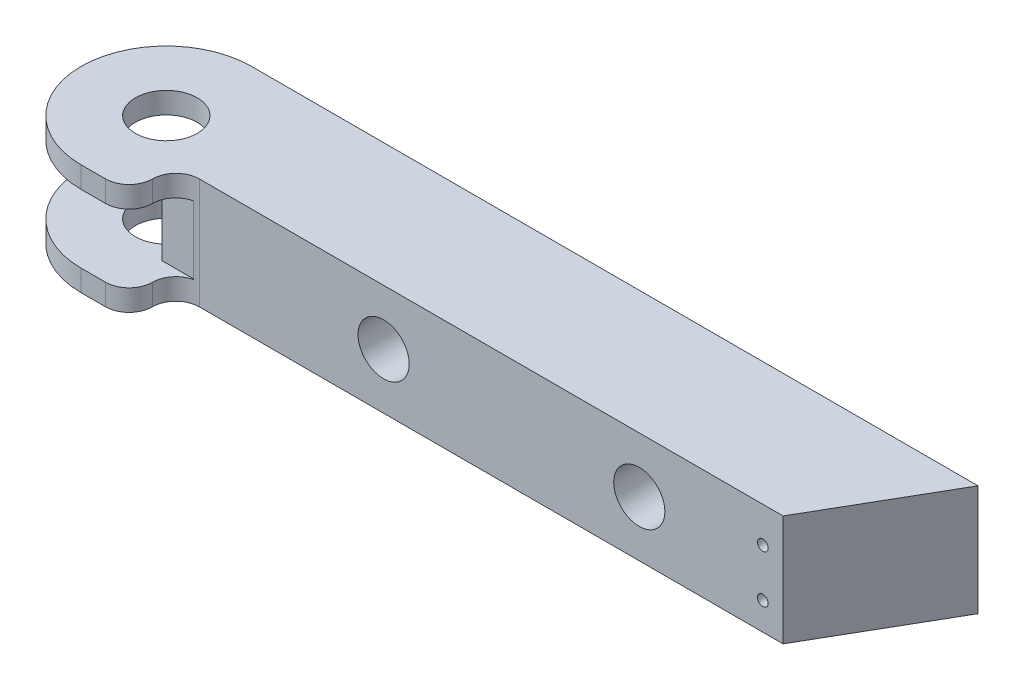
ISO-10303-21;
HEADER;
FILE_DESCRIPTION(('STEP AP214'),'2;1');
FILE_NAME('part.step','',(''),(''),'','','');
FILE_SCHEMA(('AUTOMOTIVE_DESIGN { 1 0 10303 214 1 1 1 1 }'));
ENDSEC;
DATA;
#1=APPLICATION_CONTEXT('core data for automotive mechanical design processes');
#2=APPLICATION_PROTOCOL_DEFINITION('international standard','automotive_design',2000,#1);
#3=PRODUCT_CONTEXT('',#1,'mechanical');
#4=PRODUCT('Part','Part','',(#3));
#5=PRODUCT_RELATED_PRODUCT_CATEGORY('part','',(#4));
#6=PRODUCT_DEFINITION_FORMATION('','',#4);
#7=PRODUCT_DEFINITION_CONTEXT('part definition',#1,'design');
#8=PRODUCT_DEFINITION('design','',#6,#7);
#9=PRODUCT_DEFINITION_SHAPE('','',#8);
#10=(LENGTH_UNIT() NAMED_UNIT(*) SI_UNIT(.MILLI.,.METRE.));
#11=(NAMED_UNIT(*) PLANE_ANGLE_UNIT() SI_UNIT($,.RADIAN.));
#12=(NAMED_UNIT(*) SI_UNIT($,.STERADIAN.) SOLID_ANGLE_UNIT());
#13=UNCERTAINTY_MEASURE_WITH_UNIT(LENGTH_MEASURE(1.E-05),#10,'distance_accuracy_value','');
#14=(GEOMETRIC_REPRESENTATION_CONTEXT(3) GLOBAL_UNCERTAINTY_ASSIGNED_CONTEXT((#13)) GLOBAL_UNIT_ASSIGNED_CONTEXT((#10,
#11,#12)) REPRESENTATION_CONTEXT('',''));
#15=CARTESIAN_POINT('',(0.,0.,0.));
#16=DIRECTION('',(0.,0.,1.));
#17=DIRECTION('',(1.,0.,0.));
#18=AXIS2_PLACEMENT_3D('',#15,#16,#17);
#19=CARTESIAN_POINT('',(-5.61288074759463,0.,-0.0974134343959925));
#20=DIRECTION('',(0.,1.,0.));
#21=DIRECTION('',(0.,0.,1.));
#22=AXIS2_PLACEMENT_3D('',#19,#20,#21);
#23=CYLINDRICAL_SURFACE('',#22,1.45);
#24=CARTESIAN_POINT('',(-5.61288074759463,5.2,-0.0974134343959925));
#25=DIRECTION('',(0.,1.,0.));
#26=DIRECTION('',(0.,0.,1.));
#27=AXIS2_PLACEMENT_3D('',#24,#25,#26);
#28=CIRCLE('',#27,1.45);
#29=CARTESIAN_POINT('',(-5.61288074759463,5.2,1.35258656560401));
#30=VERTEX_POINT('',#29);
#31=EDGE_CURVE('E199',#30,#30,#28,.T.);
#32=ORIENTED_EDGE('',*,*,#31,.T.);
#33=EDGE_LOOP('',(#32));
#34=FACE_BOUND('',#33,.T.);
#35=CARTESIAN_POINT('',(-5.61288074759463,4.2,-0.0974134343959925));
#36=DIRECTION('',(0.,-1.,0.));
#37=DIRECTION('',(0.,0.,-1.));
#38=AXIS2_PLACEMENT_3D('',#35,#36,#37);
#39=CIRCLE('',#38,1.45);
#40=CARTESIAN_POINT('',(-5.61288074759463,4.2,-1.54741343439599));
#41=VERTEX_POINT('',#40);
#42=EDGE_CURVE('E263',#41,#41,#39,.F.);
#43=ORIENTED_EDGE('',*,*,#42,.F.);
#44=EDGE_LOOP('',(#43));
#45=FACE_BOUND('',#44,.T.);
#46=ADVANCED_FACE('F35',(#34,#45),#23,.F.);
#47=CARTESIAN_POINT('',(-5.61288074759464,1.,-4.09741343439599));
#48=DIRECTION('',(1.,0.,0.));
#49=DIRECTION('',(0.,0.,-1.));
#50=AXIS2_PLACEMENT_3D('',#47,#48,#49);
#51=PLANE('',#50);
#52=DIRECTION('',(0.,1.,0.));
#53=VECTOR('',#52,1.);
#54=CARTESIAN_POINT('',(-5.61288074759464,-5.78822509939086,-2.49741343439599));
#55=LINE('',#54,#53);
#56=CARTESIAN_POINT('',(-5.61288074759464,4.2,-2.49741343439599));
#57=VERTEX_POINT('',#56);
#58=CARTESIAN_POINT('',(-5.61288074759464,1.,-2.49741343439599));
#59=VERTEX_POINT('',#58);
#60=EDGE_CURVE('E156',#57,#59,#55,.F.);
#61=ORIENTED_EDGE('',*,*,#60,.F.);
#62=DIRECTION('',(0.,0.,-1.));
#63=VECTOR('',#62,1.);
#64=CARTESIAN_POINT('',(-5.61288074759464,4.2,-4.09741343439599));
#65=LINE('',#64,#63);
#66=CARTESIAN_POINT('',(-5.61288074759464,4.2,-4.09741343439599));
#67=VERTEX_POINT('',#66);
#68=EDGE_CURVE('E188',#57,#67,#65,.T.);
#69=ORIENTED_EDGE('',*,*,#68,.T.);
#70=DIRECTION('',(0.,1.,0.));
#71=VECTOR('',#70,1.);
#72=CARTESIAN_POINT('',(-5.61288074759464,1.,-4.09741343439599));
#73=LINE('',#72,#71);
#74=CARTESIAN_POINT('',(-5.61288074759464,1.,-4.09741343439599));
#75=VERTEX_POINT('',#74);
#76=EDGE_CURVE('E177',#75,#67,#73,.T.);
#77=ORIENTED_EDGE('',*,*,#76,.F.);
#78=DIRECTION('',(0.,0.,-1.));
#79=VECTOR('',#78,1.);
#80=CARTESIAN_POINT('',(-5.61288074759464,1.,-4.09741343439599));
#81=LINE('',#80,#79);
#82=EDGE_CURVE('E170',#59,#75,#81,.T.);
#83=ORIENTED_EDGE('',*,*,#82,.F.);
#84=EDGE_LOOP('',(#61,#69,#77,#83));
#85=FACE_BOUND('',#84,.T.);
#86=ADVANCED_FACE('F175',(#85),#51,.F.);
#87=CARTESIAN_POINT('',(-5.61288074759463,-2.80131556174964,1.70258656560401));
#88=DIRECTION('',(0.,0.,1.));
#89=DIRECTION('',(1.,0.,0.));
#90=AXIS2_PLACEMENT_3D('',#87,#88,#89);
#91=PLANE('',#90);
#92=DIRECTION('',(1.,0.,0.));
#93=VECTOR('',#92,1.);
#94=CARTESIAN_POINT('',(-5.61288074759463,4.2,1.70258656560401));
#95=LINE('',#94,#93);
#96=CARTESIAN_POINT('',(-4.02542996095588,4.2,1.70258656560401));
#97=VERTEX_POINT('',#96);
#98=CARTESIAN_POINT('',(-2.51288074759464,4.2,1.70258656560401));
#99=VERTEX_POINT('',#98);
#100=EDGE_CURVE('E165',#97,#99,#95,.T.);
#101=ORIENTED_EDGE('',*,*,#100,.F.);
#102=DIRECTION('',(0.,1.,0.));
#103=VECTOR('',#102,1.);
#104=CARTESIAN_POINT('',(-4.02542996095588,-5.78822509939086,1.70258656560401));
#105=LINE('',#104,#103);
#106=CARTESIAN_POINT('',(-4.02542996095588,1.,1.70258656560401));
#107=VERTEX_POINT('',#106);
#108=EDGE_CURVE('E11',#97,#107,#105,.F.);
#109=ORIENTED_EDGE('',*,*,#108,.T.);
#110=DIRECTION('',(1.,0.,0.));
#111=VECTOR('',#110,1.);
#112=CARTESIAN_POINT('',(-5.61288074759463,1.,1.70258656560401));
#113=LINE('',#112,#111);
#114=CARTESIAN_POINT('',(-2.51288074759464,1.,1.70258656560401));
#115=VERTEX_POINT('',#114);
#116=EDGE_CURVE('E173',#107,#115,#113,.T.);
#117=ORIENTED_EDGE('',*,*,#116,.T.);
#118=DIRECTION('',(0.,1.,0.));
#119=VECTOR('',#118,1.);
#120=CARTESIAN_POINT('',(-2.51288074759464,-2.80131556174964,1.70258656560401));
#121=LINE('',#120,#119);
#122=EDGE_CURVE('E297',#115,#99,#121,.T.);
#123=ORIENTED_EDGE('',*,*,#122,.T.);
#124=EDGE_LOOP('',(#101,#109,#117,#123));
#125=FACE_BOUND('',#124,.T.);
#126=ADVANCED_FACE('F338',(#125),#91,.T.);
#127=CARTESIAN_POINT('',(-9.61288074759463,5.2,3.90258656560401));
#128=DIRECTION('',(0.,0.,-1.));
#129=DIRECTION('',(-1.,0.,0.));
#130=AXIS2_PLACEMENT_3D('',#127,#128,#129);
#131=PLANE('',#130);
#132=DIRECTION('',(-1.,0.,0.));
#133=VECTOR('',#132,1.);
#134=CARTESIAN_POINT('',(-5.61288074759463,4.2,3.90258656560401));
#135=LINE('',#134,#133);
#136=CARTESIAN_POINT('',(-4.46288074759464,4.2,3.90258656560401));
#137=VERTEX_POINT('',#136);
#138=CARTESIAN_POINT('',(-5.61288074759463,4.2,3.90258656560401));
#139=VERTEX_POINT('',#138);
#140=EDGE_CURVE('E291',#137,#139,#135,.T.);
#141=ORIENTED_EDGE('',*,*,#140,.F.);
#142=DIRECTION('',(0.,1.,0.));
#143=VECTOR('',#142,1.);
#144=CARTESIAN_POINT('',(-4.46288074759464,5.2,3.90258656560401));
#145=LINE('',#144,#143);
#146=CARTESIAN_POINT('',(-4.46288074759464,5.2,3.90258656560401));
#147=VERTEX_POINT('',#146);
#148=EDGE_CURVE('E254',#137,#147,#145,.T.);
#149=ORIENTED_EDGE('',*,*,#148,.T.);
#150=DIRECTION('',(1.,0.,0.));
#151=VECTOR('',#150,1.);
#152=CARTESIAN_POINT('',(-9.61288074759463,5.2,3.90258656560401));
#153=LINE('',#152,#151);
#154=CARTESIAN_POINT('',(-5.61288074759463,5.2,3.90258656560401));
#155=VERTEX_POINT('',#154);
#156=EDGE_CURVE('E207',#155,#147,#153,.T.);
#157=ORIENTED_EDGE('',*,*,#156,.F.);
#158=DIRECTION('',(0.,-1.,0.));
#159=VECTOR('',#158,1.);
#160=CARTESIAN_POINT('',(-5.61288074759463,5.2,3.90258656560401));
#161=LINE('',#160,#159);
#162=EDGE_CURVE('E237',#155,#139,#161,.T.);
#163=ORIENTED_EDGE('',*,*,#162,.T.);
#164=EDGE_LOOP('',(#141,#149,#157,#163));
#165=FACE_BOUND('',#164,.T.);
#166=ADVANCED_FACE('F323',(#165),#131,.F.);
#167=CARTESIAN_POINT('',(-2.26288074759464,0.,2.80258656560401));
#168=DIRECTION('',(0.,-1.,0.));
#169=DIRECTION('',(0.,0.,-1.));
#170=AXIS2_PLACEMENT_3D('',#167,#168,#169);
#171=CYLINDRICAL_SURFACE('',#170,1.1);
#172=CARTESIAN_POINT('',(-2.26288074759464,4.2,2.80258656560401));
#173=DIRECTION('',(0.,-1.,0.));
#174=DIRECTION('',(0.,0.,-1.));
#175=AXIS2_PLACEMENT_3D('',#172,#173,#174);
#176=CIRCLE('',#175,1.1);
#177=CARTESIAN_POINT('',(-2.51288074759464,4.2,1.73137230132258));
#178=VERTEX_POINT('',#177);
#179=CARTESIAN_POINT('',(-3.36288074759464,4.2,2.80258656560401));
#180=VERTEX_POINT('',#179);
#181=EDGE_CURVE('E313',#178,#180,#176,.F.);
#182=ORIENTED_EDGE('',*,*,#181,.F.);
#183=DIRECTION('',(0.,-1.,0.));
#184=VECTOR('',#183,1.);
#185=CARTESIAN_POINT('',(-2.51288074759464,0.,1.73137230132258));
#186=LINE('',#185,#184);
#187=CARTESIAN_POINT('',(-2.51288074759464,1.,1.73137230132258));
#188=VERTEX_POINT('',#187);
#189=EDGE_CURVE('E44',#188,#178,#186,.F.);
#190=ORIENTED_EDGE('',*,*,#189,.F.);
#191=CARTESIAN_POINT('',(-2.26288074759464,1.,2.80258656560401));
#192=DIRECTION('',(0.,-1.,0.));
#193=DIRECTION('',(0.,0.,-1.));
#194=AXIS2_PLACEMENT_3D('',#191,#192,#193);
#195=CIRCLE('',#194,1.1);
#196=CARTESIAN_POINT('',(-3.36288074759464,0.999999999999999,2.80258656560401));
#197=VERTEX_POINT('',#196);
#198=EDGE_CURVE('E308',#188,#197,#195,.F.);
#199=ORIENTED_EDGE('',*,*,#198,.T.);
#200=DIRECTION('',(0.,1.,0.));
#201=VECTOR('',#200,1.);
#202=CARTESIAN_POINT('',(-3.36288074759464,5.2,2.80258656560401));
#203=LINE('',#202,#201);
#204=CARTESIAN_POINT('',(-3.36288074759464,0.,2.80258656560401));
#205=VERTEX_POINT('',#204);
#206=EDGE_CURVE('E243',#205,#197,#203,.T.);
#207=ORIENTED_EDGE('',*,*,#206,.F.);
#208=CARTESIAN_POINT('',(-2.26288074759464,0.,2.80258656560401));
#209=DIRECTION('',(0.,1.,0.));
#210=DIRECTION('',(0.,0.,1.));
#211=AXIS2_PLACEMENT_3D('',#208,#209,#210);
#212=CIRCLE('',#211,1.1);
#213=CARTESIAN_POINT('',(-2.26288074759464,0.,1.70258656560401));
#214=VERTEX_POINT('',#213);
#215=EDGE_CURVE('E252',#214,#205,#212,.T.);
#216=ORIENTED_EDGE('',*,*,#215,.F.);
#217=DIRECTION('',(0.,1.,0.));
#218=VECTOR('',#217,1.);
#219=CARTESIAN_POINT('',(-2.26288074759464,0.,1.70258656560401));
#220=LINE('',#219,#218);
#221=CARTESIAN_POINT('',(-2.26288074759464,5.2,1.70258656560401));
#222=VERTEX_POINT('',#221);
#223=EDGE_CURVE('E246',#222,#214,#220,.F.);
#224=ORIENTED_EDGE('',*,*,#223,.F.);
#225=CARTESIAN_POINT('',(-2.26288074759464,5.2,2.80258656560401));
#226=DIRECTION('',(0.,1.,0.));
#227=DIRECTION('',(0.,0.,1.));
#228=AXIS2_PLACEMENT_3D('',#225,#226,#227);
#229=CIRCLE('',#228,1.1);
#230=CARTESIAN_POINT('',(-3.36288074759464,5.2,2.80258656560401));
#231=VERTEX_POINT('',#230);
#232=EDGE_CURVE('E249',#231,#222,#229,.F.);
#233=ORIENTED_EDGE('',*,*,#232,.F.);
#234=EDGE_CURVE('E240',#180,#231,#203,.T.);
#235=ORIENTED_EDGE('',*,*,#234,.F.);
#236=EDGE_LOOP('',(#182,#190,#199,#207,#216,#224,#233,#235));
#237=FACE_BOUND('',#236,.T.);
#238=ADVANCED_FACE('F346',(#237),#171,.F.);
#239=CARTESIAN_POINT('',(-4.46288074759464,5.2,2.80258656560401));
#240=DIRECTION('',(0.,1.,0.));
#241=DIRECTION('',(0.,0.,1.));
#242=AXIS2_PLACEMENT_3D('',#239,#240,#241);
#243=CYLINDRICAL_SURFACE('',#242,1.1);
#244=ORIENTED_EDGE('',*,*,#148,.F.);
#245=CARTESIAN_POINT('',(-4.46288074759464,4.2,2.80258656560401));
#246=DIRECTION('',(0.,-1.,0.));
#247=DIRECTION('',(0.,0.,-1.));
#248=AXIS2_PLACEMENT_3D('',#245,#246,#247);
#249=CIRCLE('',#248,1.1);
#250=EDGE_CURVE('E311',#137,#180,#249,.F.);
#251=ORIENTED_EDGE('',*,*,#250,.T.);
#252=ORIENTED_EDGE('',*,*,#234,.T.);
#253=CARTESIAN_POINT('',(-4.46288074759464,5.2,2.80258656560401));
#254=DIRECTION('',(0.,1.,0.));
#255=DIRECTION('',(0.,0.,1.));
#256=AXIS2_PLACEMENT_3D('',#253,#254,#255);
#257=CIRCLE('',#256,1.1);
#258=EDGE_CURVE('E258',#147,#231,#257,.T.);
#259=ORIENTED_EDGE('',*,*,#258,.F.);
#260=EDGE_LOOP('',(#244,#251,#252,#259));
#261=FACE_BOUND('',#260,.T.);
#262=ADVANCED_FACE('F349',(#261),#243,.T.);
#263=CARTESIAN_POINT('',(-5.61288074759463,5.2,-0.0974134343959933));
#264=DIRECTION('',(0.,-1.,0.));
#265=DIRECTION('',(0.,0.,-1.));
#266=AXIS2_PLACEMENT_3D('',#263,#264,#265);
#267=CYLINDRICAL_SURFACE('',#266,4.);
#268=DIRECTION('',(0.,-1.,0.));
#269=VECTOR('',#268,1.);
#270=CARTESIAN_POINT('',(-9.61288074759463,5.2,-0.0974134343959925));
#271=LINE('',#270,#269);
#272=CARTESIAN_POINT('',(-9.61288074759463,4.2,-0.0974134343959925));
#273=VERTEX_POINT('',#272);
#274=CARTESIAN_POINT('',(-9.61288074759463,5.2,-0.0974134343959925));
#275=VERTEX_POINT('',#274);
#276=EDGE_CURVE('E204',#273,#275,#271,.F.);
#277=ORIENTED_EDGE('',*,*,#276,.F.);
#278=CARTESIAN_POINT('',(-5.61288074759463,4.2,-0.0974134343959925));
#279=DIRECTION('',(0.,1.,0.));
#280=DIRECTION('',(0.,0.,-1.));
#281=AXIS2_PLACEMENT_3D('',#278,#279,#280);
#282=CIRCLE('',#281,4.);
#283=EDGE_CURVE('E52',#273,#139,#282,.T.);
#284=ORIENTED_EDGE('',*,*,#283,.T.);
#285=ORIENTED_EDGE('',*,*,#162,.F.);
#286=CARTESIAN_POINT('',(-5.61288074759463,5.2,-0.0974134343959933));
#287=DIRECTION('',(0.,1.,0.));
#288=DIRECTION('',(0.,0.,1.));
#289=AXIS2_PLACEMENT_3D('',#286,#287,#288);
#290=CIRCLE('',#289,4.);
#291=EDGE_CURVE('E231',#275,#155,#290,.T.);
#292=ORIENTED_EDGE('',*,*,#291,.F.);
#293=EDGE_LOOP('',(#277,#284,#285,#292));
#294=FACE_BOUND('',#293,.T.);
#295=ADVANCED_FACE('F318',(#294),#267,.T.);
#296=CARTESIAN_POINT('',(-5.61288074759463,5.2,-0.0974134343959933));
#297=DIRECTION('',(0.,-1.,0.));
#298=DIRECTION('',(0.,0.,-1.));
#299=AXIS2_PLACEMENT_3D('',#296,#297,#298);
#300=CYLINDRICAL_SURFACE('',#299,4.);
#301=DIRECTION('',(0.,-1.,0.));
#302=VECTOR('',#301,1.);
#303=CARTESIAN_POINT('',(-5.61288074759463,5.2,-4.09741343439599));
#304=LINE('',#303,#302);
#305=CARTESIAN_POINT('',(-5.61288074759464,5.2,-4.09741343439599));
#306=VERTEX_POINT('',#305);
#307=EDGE_CURVE('E227',#67,#306,#304,.F.);
#308=ORIENTED_EDGE('',*,*,#307,.F.);
#309=EDGE_CURVE('E186',#67,#273,#282,.T.);
#310=ORIENTED_EDGE('',*,*,#309,.T.);
#311=ORIENTED_EDGE('',*,*,#276,.T.);
#312=CARTESIAN_POINT('',(-5.61288074759463,5.2,-0.0974134343959933));
#313=DIRECTION('',(0.,1.,0.));
#314=DIRECTION('',(0.,0.,1.));
#315=AXIS2_PLACEMENT_3D('',#312,#313,#314);
#316=CIRCLE('',#315,4.);
#317=EDGE_CURVE('E233',#306,#275,#316,.T.);
#318=ORIENTED_EDGE('',*,*,#317,.F.);
#319=EDGE_LOOP('',(#308,#310,#311,#318));
#320=FACE_BOUND('',#319,.T.);
#321=ADVANCED_FACE('F334',(#320),#300,.T.);
#322=CARTESIAN_POINT('',(-4.46288074759464,0.,3.90258656560401));
#323=VERTEX_POINT('',#322);
#324=CARTESIAN_POINT('',(-4.46288074759464,0.999999999999999,3.90258656560401));
#325=VERTEX_POINT('',#324);
#326=EDGE_CURVE('E255',#323,#325,#145,.T.);
#327=ORIENTED_EDGE('',*,*,#326,.T.);
#328=DIRECTION('',(-1.,0.,0.));
#329=VECTOR('',#328,1.);
#330=CARTESIAN_POINT('',(-5.61288074759463,1.,3.90258656560401));
#331=LINE('',#330,#329);
#332=CARTESIAN_POINT('',(-5.61288074759463,1.,3.90258656560401));
#333=VERTEX_POINT('',#332);
#334=EDGE_CURVE('E293',#325,#333,#331,.T.);
#335=ORIENTED_EDGE('',*,*,#334,.T.);
#336=CARTESIAN_POINT('',(-5.61288074759463,0.,3.90258656560401));
#337=VERTEX_POINT('',#336);
#338=EDGE_CURVE('E236',#333,#337,#161,.T.);
#339=ORIENTED_EDGE('',*,*,#338,.T.);
#340=DIRECTION('',(1.,0.,0.));
#341=VECTOR('',#340,1.);
#342=CARTESIAN_POINT('',(-9.61288074759463,0.,3.90258656560401));
#343=LINE('',#342,#341);
#344=EDGE_CURVE('E215',#337,#323,#343,.T.);
#345=ORIENTED_EDGE('',*,*,#344,.T.);
#346=EDGE_LOOP('',(#327,#335,#339,#345));
#347=FACE_BOUND('',#346,.T.);
#348=ADVANCED_FACE('F404',(#347),#131,.F.);
#349=CARTESIAN_POINT('',(-9.61288074759463,5.2,-4.09741343439599));
#350=DIRECTION('',(0.,0.,1.));
#351=DIRECTION('',(1.,0.,0.));
#352=AXIS2_PLACEMENT_3D('',#349,#350,#351);
#353=PLANE('',#352);
#354=CARTESIAN_POINT('',(24.1871192524054,3.53944035944664,-4.09741343439599));
#355=DIRECTION('',(0.,0.,-1.));
#356=DIRECTION('',(-1.,0.,0.));
#357=AXIS2_PLACEMENT_3D('',#354,#355,#356);
#358=CIRCLE('',#357,0.25);
#359=CARTESIAN_POINT('',(23.9371192524054,3.53944035944664,-4.09741343439599));
#360=VERTEX_POINT('',#359);
#361=EDGE_CURVE('E448',#360,#360,#358,.T.);
#362=ORIENTED_EDGE('',*,*,#361,.F.);
#363=EDGE_LOOP('',(#362));
#364=FACE_BOUND('',#363,.T.);
#365=CARTESIAN_POINT('',(24.1871192524054,1.29267803209743,-4.09741343439599));
#366=DIRECTION('',(0.,0.,-1.));
#367=DIRECTION('',(-1.,0.,0.));
#368=AXIS2_PLACEMENT_3D('',#365,#366,#367);
#369=CIRCLE('',#368,0.25);
#370=CARTESIAN_POINT('',(23.9371192524054,1.29267803209743,-4.09741343439599));
#371=VERTEX_POINT('',#370);
#372=EDGE_CURVE('E284',#371,#371,#369,.T.);
#373=ORIENTED_EDGE('',*,*,#372,.F.);
#374=EDGE_LOOP('',(#373));
#375=FACE_BOUND('',#374,.T.);
#376=CARTESIAN_POINT('',(6.38711925240536,2.6,-4.09741343439599));
#377=DIRECTION('',(0.,0.,-1.));
#378=DIRECTION('',(-1.,0.,0.));
#379=AXIS2_PLACEMENT_3D('',#376,#377,#378);
#380=CIRCLE('',#379,1.2);
#381=CARTESIAN_POINT('',(5.18711925240536,2.6,-4.09741343439599));
#382=VERTEX_POINT('',#381);
#383=EDGE_CURVE('E272',#382,#382,#380,.T.);
#384=ORIENTED_EDGE('',*,*,#383,.F.);
#385=EDGE_LOOP('',(#384));
#386=FACE_BOUND('',#385,.T.);
#387=CARTESIAN_POINT('',(18.3871192524054,2.6,-4.09741343439599));
#388=DIRECTION('',(0.,0.,-1.));
#389=DIRECTION('',(-1.,0.,0.));
#390=AXIS2_PLACEMENT_3D('',#387,#388,#389);
#391=CIRCLE('',#390,1.2);
#392=CARTESIAN_POINT('',(17.1871192524054,2.6,-4.09741343439599));
#393=VERTEX_POINT('',#392);
#394=EDGE_CURVE('E271',#393,#393,#391,.T.);
#395=ORIENTED_EDGE('',*,*,#394,.F.);
#396=EDGE_LOOP('',(#395));
#397=FACE_BOUND('',#396,.T.);
#398=DIRECTION('',(-1.,0.,0.));
#399=VECTOR('',#398,1.);
#400=CARTESIAN_POINT('',(-9.61288074759463,0.,-4.09741343439599));
#401=LINE('',#400,#399);
#402=CARTESIAN_POINT('',(28.4871192524054,0.,-4.09741343439599));
#403=VERTEX_POINT('',#402);
#404=CARTESIAN_POINT('',(-5.61288074759464,0.,-4.09741343439599));
#405=VERTEX_POINT('',#404);
#406=EDGE_CURVE('E211',#403,#405,#401,.T.);
#407=ORIENTED_EDGE('',*,*,#406,.T.);
#408=EDGE_CURVE('E228',#405,#75,#304,.F.);
#409=ORIENTED_EDGE('',*,*,#408,.T.);
#410=ORIENTED_EDGE('',*,*,#76,.T.);
#411=ORIENTED_EDGE('',*,*,#307,.T.);
#412=DIRECTION('',(-1.,0.,0.));
#413=VECTOR('',#412,1.);
#414=CARTESIAN_POINT('',(-9.61288074759463,5.2,-4.09741343439599));
#415=LINE('',#414,#413);
#416=CARTESIAN_POINT('',(28.4871192524054,5.2,-4.09741343439599));
#417=VERTEX_POINT('',#416);
#418=EDGE_CURVE('E210',#417,#306,#415,.T.);
#419=ORIENTED_EDGE('',*,*,#418,.F.);
#420=DIRECTION('',(0.,-1.,0.));
#421=VECTOR('',#420,1.);
#422=CARTESIAN_POINT('',(28.4871192524054,5.2,-4.09741343439599));
#423=LINE('',#422,#421);
#424=EDGE_CURVE('E214',#417,#403,#423,.T.);
#425=ORIENTED_EDGE('',*,*,#424,.T.);
#426=EDGE_LOOP('',(#407,#409,#410,#411,#419,#425));
#427=FACE_BOUND('',#426,.T.);
#428=ADVANCED_FACE('F395',(#364,#375,#386,#397,#427),#353,.F.);
#429=CARTESIAN_POINT('',(0.,5.2,0.));
#430=DIRECTION('',(0.,1.,0.));
#431=DIRECTION('',(0.,0.,1.));
#432=AXIS2_PLACEMENT_3D('',#429,#430,#431);
#433=PLANE('',#432);
#434=DIRECTION('',(-0.499999999999998,0.,0.86602540378444));
#435=VECTOR('',#434,1.);
#436=CARTESIAN_POINT('',(28.4871192524054,5.2,-4.09741343439599));
#437=LINE('',#436,#435);
#438=CARTESIAN_POINT('',(25.1384876911056,5.2,1.70258656560401));
#439=VERTEX_POINT('',#438);
#440=EDGE_CURVE('E60',#417,#439,#437,.T.);
#441=ORIENTED_EDGE('',*,*,#440,.F.);
#442=ORIENTED_EDGE('',*,*,#418,.T.);
#443=ORIENTED_EDGE('',*,*,#317,.T.);
#444=ORIENTED_EDGE('',*,*,#291,.T.);
#445=ORIENTED_EDGE('',*,*,#156,.T.);
#446=ORIENTED_EDGE('',*,*,#258,.T.);
#447=ORIENTED_EDGE('',*,*,#232,.T.);
#448=DIRECTION('',(-1.,0.,0.));
#449=VECTOR('',#448,1.);
#450=CARTESIAN_POINT('',(28.4871192524054,5.2,1.70258656560401));
#451=LINE('',#450,#449);
#452=EDGE_CURVE('E196',#439,#222,#451,.T.);
#453=ORIENTED_EDGE('',*,*,#452,.F.);
#454=EDGE_LOOP('',(#441,#442,#443,#444,#445,#446,#447,#453));
#455=FACE_BOUND('',#454,.T.);
#456=ORIENTED_EDGE('',*,*,#31,.F.);
#457=EDGE_LOOP('',(#456));
#458=FACE_BOUND('',#457,.T.);
#459=ADVANCED_FACE('F327',(#455,#458),#433,.T.);
#460=CARTESIAN_POINT('',(0.,0.,0.));
#461=DIRECTION('',(0.,1.,0.));
#462=DIRECTION('',(0.,0.,1.));
#463=AXIS2_PLACEMENT_3D('',#460,#461,#462);
#464=PLANE('',#463);
#465=CARTESIAN_POINT('',(-5.61288074759463,0.,-0.0974134343959925));
#466=DIRECTION('',(0.,1.,0.));
#467=DIRECTION('',(0.,0.,1.));
#468=AXIS2_PLACEMENT_3D('',#465,#466,#467);
#469=CIRCLE('',#468,1.45);
#470=CARTESIAN_POINT('',(-5.61288074759463,0.,1.35258656560401));
#471=VERTEX_POINT('',#470);
#472=EDGE_CURVE('E201',#471,#471,#469,.T.);
#473=ORIENTED_EDGE('',*,*,#472,.T.);
#474=EDGE_LOOP('',(#473));
#475=FACE_BOUND('',#474,.T.);
#476=ORIENTED_EDGE('',*,*,#406,.F.);
#477=DIRECTION('',(-0.499999999999998,0.,0.86602540378444));
#478=VECTOR('',#477,1.);
#479=CARTESIAN_POINT('',(28.4871192524054,0.,-4.09741343439599));
#480=LINE('',#479,#478);
#481=CARTESIAN_POINT('',(25.1384876911056,0.,1.70258656560401));
#482=VERTEX_POINT('',#481);
#483=EDGE_CURVE('E190',#403,#482,#480,.T.);
#484=ORIENTED_EDGE('',*,*,#483,.T.);
#485=DIRECTION('',(-1.,0.,0.));
#486=VECTOR('',#485,1.);
#487=CARTESIAN_POINT('',(28.4871192524054,0.,1.70258656560401));
#488=LINE('',#487,#486);
#489=EDGE_CURVE('E197',#482,#214,#488,.T.);
#490=ORIENTED_EDGE('',*,*,#489,.T.);
#491=ORIENTED_EDGE('',*,*,#215,.T.);
#492=CARTESIAN_POINT('',(-4.46288074759464,0.,2.80258656560401));
#493=DIRECTION('',(0.,1.,0.));
#494=DIRECTION('',(0.,0.,1.));
#495=AXIS2_PLACEMENT_3D('',#492,#493,#494);
#496=CIRCLE('',#495,1.1);
#497=EDGE_CURVE('E261',#205,#323,#496,.F.);
#498=ORIENTED_EDGE('',*,*,#497,.T.);
#499=ORIENTED_EDGE('',*,*,#344,.F.);
#500=CARTESIAN_POINT('',(-5.61288074759463,0.,-0.0974134343959933));
#501=DIRECTION('',(0.,1.,0.));
#502=DIRECTION('',(0.,0.,1.));
#503=AXIS2_PLACEMENT_3D('',#500,#501,#502);
#504=CIRCLE('',#503,4.);
#505=CARTESIAN_POINT('',(-9.61288074759463,0.,-0.0974134343959925));
#506=VERTEX_POINT('',#505);
#507=EDGE_CURVE('E223',#337,#506,#504,.F.);
#508=ORIENTED_EDGE('',*,*,#507,.T.);
#509=CARTESIAN_POINT('',(-5.61288074759463,0.,-0.0974134343959933));
#510=DIRECTION('',(0.,1.,0.));
#511=DIRECTION('',(0.,0.,1.));
#512=AXIS2_PLACEMENT_3D('',#509,#510,#511);
#513=CIRCLE('',#512,4.);
#514=EDGE_CURVE('E225',#506,#405,#513,.F.);
#515=ORIENTED_EDGE('',*,*,#514,.T.);
#516=EDGE_LOOP('',(#476,#484,#490,#491,#498,#499,#508,#515));
#517=FACE_BOUND('',#516,.T.);
#518=ADVANCED_FACE('F386',(#475,#517),#464,.F.);
#519=CARTESIAN_POINT('',(-5.61288074759463,1.,-0.0974134343959925));
#520=DIRECTION('',(0.,1.,0.));
#521=DIRECTION('',(0.,0.,-1.));
#522=AXIS2_PLACEMENT_3D('',#519,#520,#521);
#523=CIRCLE('',#522,4.);
#524=CARTESIAN_POINT('',(-9.61288074759463,1.,-0.0974134343959925));
#525=VERTEX_POINT('',#524);
#526=EDGE_CURVE('E182',#525,#333,#523,.T.);
#527=ORIENTED_EDGE('',*,*,#526,.F.);
#528=EDGE_CURVE('E218',#506,#525,#271,.F.);
#529=ORIENTED_EDGE('',*,*,#528,.F.);
#530=ORIENTED_EDGE('',*,*,#507,.F.);
#531=ORIENTED_EDGE('',*,*,#338,.F.);
#532=EDGE_LOOP('',(#527,#529,#530,#531));
#533=FACE_BOUND('',#532,.T.);
#534=ADVANCED_FACE('F356',(#533),#267,.T.);
#535=EDGE_CURVE('E179',#75,#525,#523,.T.);
#536=ORIENTED_EDGE('',*,*,#535,.F.);
#537=ORIENTED_EDGE('',*,*,#408,.F.);
#538=ORIENTED_EDGE('',*,*,#514,.F.);
#539=ORIENTED_EDGE('',*,*,#528,.T.);
#540=EDGE_LOOP('',(#536,#537,#538,#539));
#541=FACE_BOUND('',#540,.T.);
#542=ADVANCED_FACE('F373',(#541),#300,.T.);
#543=CARTESIAN_POINT('',(-5.61288074759463,1.,-0.0974134343959925));
#544=DIRECTION('',(0.,-1.,0.));
#545=DIRECTION('',(0.,0.,-1.));
#546=AXIS2_PLACEMENT_3D('',#543,#544,#545);
#547=CIRCLE('',#546,1.45);
#548=CARTESIAN_POINT('',(-5.61288074759463,1.,-1.54741343439599));
#549=VERTEX_POINT('',#548);
#550=EDGE_CURVE('E266',#549,#549,#547,.F.);
#551=ORIENTED_EDGE('',*,*,#550,.T.);
#552=EDGE_LOOP('',(#551));
#553=FACE_BOUND('',#552,.T.);
#554=ORIENTED_EDGE('',*,*,#472,.F.);
#555=EDGE_LOOP('',(#554));
#556=FACE_BOUND('',#555,.T.);
#557=ADVANCED_FACE('F364',(#553,#556),#23,.F.);
#558=CARTESIAN_POINT('',(28.4871192524054,0.,1.70258656560401));
#559=DIRECTION('',(0.,0.,-1.));
#560=DIRECTION('',(-1.,0.,0.));
#561=AXIS2_PLACEMENT_3D('',#558,#559,#560);
#562=PLANE('',#561);
#563=CARTESIAN_POINT('',(24.1871192524054,3.53944035944664,1.70258656560401));
#564=DIRECTION('',(0.,0.,-1.));
#565=DIRECTION('',(-1.,0.,0.));
#566=AXIS2_PLACEMENT_3D('',#563,#564,#565);
#567=CIRCLE('',#566,0.249999999999999);
#568=CARTESIAN_POINT('',(23.9371192524054,3.53944035944664,1.70258656560401));
#569=VERTEX_POINT('',#568);
#570=EDGE_CURVE('E39',#569,#569,#567,.T.);
#571=ORIENTED_EDGE('',*,*,#570,.T.);
#572=EDGE_LOOP('',(#571));
#573=FACE_BOUND('',#572,.T.);
#574=CARTESIAN_POINT('',(24.1871192524054,1.29267803209743,1.70258656560401));
#575=DIRECTION('',(0.,0.,-1.));
#576=DIRECTION('',(-1.,0.,0.));
#577=AXIS2_PLACEMENT_3D('',#574,#575,#576);
#578=CIRCLE('',#577,0.249999999999999);
#579=CARTESIAN_POINT('',(23.9371192524054,1.29267803209743,1.70258656560401));
#580=VERTEX_POINT('',#579);
#581=EDGE_CURVE('E279',#580,#580,#578,.T.);
#582=ORIENTED_EDGE('',*,*,#581,.T.);
#583=EDGE_LOOP('',(#582));
#584=FACE_BOUND('',#583,.T.);
#585=CARTESIAN_POINT('',(6.38711925240536,2.6,1.70258656560401));
#586=DIRECTION('',(0.,0.,-1.));
#587=DIRECTION('',(-1.,0.,0.));
#588=AXIS2_PLACEMENT_3D('',#585,#586,#587);
#589=CIRCLE('',#588,1.2);
#590=CARTESIAN_POINT('',(5.18711925240536,2.6,1.70258656560401));
#591=VERTEX_POINT('',#590);
#592=EDGE_CURVE('E269',#591,#591,#589,.T.);
#593=ORIENTED_EDGE('',*,*,#592,.T.);
#594=EDGE_LOOP('',(#593));
#595=FACE_BOUND('',#594,.T.);
#596=CARTESIAN_POINT('',(18.3871192524054,2.6,1.70258656560401));
#597=DIRECTION('',(0.,0.,-1.));
#598=DIRECTION('',(-1.,0.,0.));
#599=AXIS2_PLACEMENT_3D('',#596,#597,#598);
#600=CIRCLE('',#599,1.2);
#601=CARTESIAN_POINT('',(17.1871192524054,2.6,1.70258656560401));
#602=VERTEX_POINT('',#601);
#603=EDGE_CURVE('E276',#602,#602,#600,.T.);
#604=ORIENTED_EDGE('',*,*,#603,.T.);
#605=EDGE_LOOP('',(#604));
#606=FACE_BOUND('',#605,.T.);
#607=ORIENTED_EDGE('',*,*,#489,.F.);
#608=DIRECTION('',(0.,1.,0.));
#609=VECTOR('',#608,1.);
#610=CARTESIAN_POINT('',(25.1384876911056,0.,1.70258656560401));
#611=LINE('',#610,#609);
#612=EDGE_CURVE('E193',#482,#439,#611,.T.);
#613=ORIENTED_EDGE('',*,*,#612,.T.);
#614=ORIENTED_EDGE('',*,*,#452,.T.);
#615=ORIENTED_EDGE('',*,*,#223,.T.);
#616=EDGE_LOOP('',(#607,#613,#614,#615));
#617=FACE_BOUND('',#616,.T.);
#618=ADVANCED_FACE('F359',(#573,#584,#595,#606,#617),#562,.F.);
#619=CARTESIAN_POINT('',(-4.46288074759464,0.999999999999999,2.80258656560401));
#620=DIRECTION('',(0.,-1.,0.));
#621=DIRECTION('',(0.,0.,-1.));
#622=AXIS2_PLACEMENT_3D('',#619,#620,#621);
#623=CIRCLE('',#622,1.1);
#624=EDGE_CURVE('E302',#325,#197,#623,.F.);
#625=ORIENTED_EDGE('',*,*,#624,.F.);
#626=ORIENTED_EDGE('',*,*,#326,.F.);
#627=ORIENTED_EDGE('',*,*,#497,.F.);
#628=ORIENTED_EDGE('',*,*,#206,.T.);
#629=EDGE_LOOP('',(#625,#626,#627,#628));
#630=FACE_BOUND('',#629,.T.);
#631=ADVANCED_FACE('F37',(#630),#243,.T.);
#632=CARTESIAN_POINT('',(28.4871192524054,0.,-4.09741343439599));
#633=DIRECTION('',(-0.86602540378444,0.,-0.499999999999998));
#634=DIRECTION('',(-0.499999999999998,0.,0.86602540378444));
#635=AXIS2_PLACEMENT_3D('',#632,#633,#634);
#636=PLANE('',#635);
#637=ORIENTED_EDGE('',*,*,#440,.T.);
#638=ORIENTED_EDGE('',*,*,#612,.F.);
#639=ORIENTED_EDGE('',*,*,#483,.F.);
#640=ORIENTED_EDGE('',*,*,#424,.F.);
#641=EDGE_LOOP('',(#637,#638,#639,#640));
#642=FACE_BOUND('',#641,.T.);
#643=ADVANCED_FACE('F358',(#642),#636,.F.);
#644=CARTESIAN_POINT('',(-5.61288074759463,1.,-0.0974134343959925));
#645=DIRECTION('',(0.,-1.,0.));
#646=DIRECTION('',(0.,0.,-1.));
#647=AXIS2_PLACEMENT_3D('',#644,#645,#646);
#648=PLANE('',#647);
#649=ORIENTED_EDGE('',*,*,#550,.F.);
#650=EDGE_LOOP('',(#649));
#651=FACE_BOUND('',#650,.T.);
#652=CARTESIAN_POINT('',(-5.61288074759463,1.,-0.0974134343959925));
#653=DIRECTION('',(0.,-1.,0.));
#654=DIRECTION('',(0.,0.,-1.));
#655=AXIS2_PLACEMENT_3D('',#652,#653,#654);
#656=CIRCLE('',#655,2.4);
#657=EDGE_CURVE('E159',#59,#107,#656,.T.);
#658=ORIENTED_EDGE('',*,*,#657,.F.);
#659=ORIENTED_EDGE('',*,*,#82,.T.);
#660=ORIENTED_EDGE('',*,*,#535,.T.);
#661=ORIENTED_EDGE('',*,*,#526,.T.);
#662=ORIENTED_EDGE('',*,*,#334,.F.);
#663=ORIENTED_EDGE('',*,*,#624,.T.);
#664=ORIENTED_EDGE('',*,*,#198,.F.);
#665=DIRECTION('',(0.,0.,1.));
#666=VECTOR('',#665,1.);
#667=CARTESIAN_POINT('',(-2.51288074759464,1.,3.90258656560401));
#668=LINE('',#667,#666);
#669=EDGE_CURVE('E299',#115,#188,#668,.T.);
#670=ORIENTED_EDGE('',*,*,#669,.F.);
#671=ORIENTED_EDGE('',*,*,#116,.F.);
#672=EDGE_LOOP('',(#658,#659,#660,#661,#662,#663,#664,#670,#671));
#673=FACE_BOUND('',#672,.T.);
#674=ADVANCED_FACE('F169',(#651,#673),#648,.F.);
#675=CARTESIAN_POINT('',(-5.61288074759463,4.2,-0.0974134343959925));
#676=DIRECTION('',(0.,-1.,0.));
#677=DIRECTION('',(0.,0.,-1.));
#678=AXIS2_PLACEMENT_3D('',#675,#676,#677);
#679=PLANE('',#678);
#680=ORIENTED_EDGE('',*,*,#42,.T.);
#681=EDGE_LOOP('',(#680));
#682=FACE_BOUND('',#681,.T.);
#683=ORIENTED_EDGE('',*,*,#68,.F.);
#684=CARTESIAN_POINT('',(-5.61288074759463,4.2,-0.0974134343959925));
#685=DIRECTION('',(0.,-1.,0.));
#686=DIRECTION('',(0.,0.,-1.));
#687=AXIS2_PLACEMENT_3D('',#684,#685,#686);
#688=CIRCLE('',#687,2.4);
#689=EDGE_CURVE('E161',#57,#97,#688,.T.);
#690=ORIENTED_EDGE('',*,*,#689,.T.);
#691=ORIENTED_EDGE('',*,*,#100,.T.);
#692=DIRECTION('',(0.,0.,1.));
#693=VECTOR('',#692,1.);
#694=CARTESIAN_POINT('',(-2.51288074759464,4.2,3.90258656560401));
#695=LINE('',#694,#693);
#696=EDGE_CURVE('E294',#99,#178,#695,.T.);
#697=ORIENTED_EDGE('',*,*,#696,.T.);
#698=ORIENTED_EDGE('',*,*,#181,.T.);
#699=ORIENTED_EDGE('',*,*,#250,.F.);
#700=ORIENTED_EDGE('',*,*,#140,.T.);
#701=ORIENTED_EDGE('',*,*,#283,.F.);
#702=ORIENTED_EDGE('',*,*,#309,.F.);
#703=EDGE_LOOP('',(#683,#690,#691,#697,#698,#699,#700,#701,#702));
#704=FACE_BOUND('',#703,.T.);
#705=ADVANCED_FACE('F335',(#682,#704),#679,.T.);
#706=CARTESIAN_POINT('',(-2.51288074759464,-2.80131556174964,3.90258656560401));
#707=DIRECTION('',(-1.,0.,0.));
#708=DIRECTION('',(0.,0.,1.));
#709=AXIS2_PLACEMENT_3D('',#706,#707,#708);
#710=PLANE('',#709);
#711=ORIENTED_EDGE('',*,*,#189,.T.);
#712=ORIENTED_EDGE('',*,*,#696,.F.);
#713=ORIENTED_EDGE('',*,*,#122,.F.);
#714=ORIENTED_EDGE('',*,*,#669,.T.);
#715=EDGE_LOOP('',(#711,#712,#713,#714));
#716=FACE_BOUND('',#715,.T.);
#717=ADVANCED_FACE('F342',(#716),#710,.T.);
#718=CARTESIAN_POINT('',(-5.61288074759463,-5.78822509939086,-0.0974134343959925));
#719=DIRECTION('',(0.,1.,0.));
#720=DIRECTION('',(0.,0.,1.));
#721=AXIS2_PLACEMENT_3D('',#718,#719,#720);
#722=CYLINDRICAL_SURFACE('',#721,2.4);
#723=ORIENTED_EDGE('',*,*,#60,.T.);
#724=ORIENTED_EDGE('',*,*,#657,.T.);
#725=ORIENTED_EDGE('',*,*,#108,.F.);
#726=ORIENTED_EDGE('',*,*,#689,.F.);
#727=EDGE_LOOP('',(#723,#724,#725,#726));
#728=FACE_BOUND('',#727,.T.);
#729=ADVANCED_FACE('F158',(#728),#722,.F.);
#730=CARTESIAN_POINT('',(18.3871192524054,2.6,-4.09741343439599));
#731=DIRECTION('',(0.,0.,-1.));
#732=DIRECTION('',(-1.,0.,0.));
#733=AXIS2_PLACEMENT_3D('',#730,#731,#732);
#734=CYLINDRICAL_SURFACE('',#733,1.2);
#735=ORIENTED_EDGE('',*,*,#394,.T.);
#736=EDGE_LOOP('',(#735));
#737=FACE_BOUND('',#736,.T.);
#738=ORIENTED_EDGE('',*,*,#603,.F.);
#739=EDGE_LOOP('',(#738));
#740=FACE_BOUND('',#739,.T.);
#741=ADVANCED_FACE('F429',(#737,#740),#734,.F.);
#742=CARTESIAN_POINT('',(6.38711925240536,2.6,-4.09741343439599));
#743=DIRECTION('',(0.,0.,-1.));
#744=DIRECTION('',(-1.,0.,0.));
#745=AXIS2_PLACEMENT_3D('',#742,#743,#744);
#746=CYLINDRICAL_SURFACE('',#745,1.2);
#747=ORIENTED_EDGE('',*,*,#383,.T.);
#748=EDGE_LOOP('',(#747));
#749=FACE_BOUND('',#748,.T.);
#750=ORIENTED_EDGE('',*,*,#592,.F.);
#751=EDGE_LOOP('',(#750));
#752=FACE_BOUND('',#751,.T.);
#753=ADVANCED_FACE('F432',(#749,#752),#746,.F.);
#754=CARTESIAN_POINT('',(24.1871192524054,1.29267803209743,-4.09741343439599));
#755=DIRECTION('',(0.,0.,-1.));
#756=DIRECTION('',(-1.,0.,0.));
#757=AXIS2_PLACEMENT_3D('',#754,#755,#756);
#758=CYLINDRICAL_SURFACE('',#757,0.249999999999999);
#759=ORIENTED_EDGE('',*,*,#372,.T.);
#760=EDGE_LOOP('',(#759));
#761=FACE_BOUND('',#760,.T.);
#762=ORIENTED_EDGE('',*,*,#581,.F.);
#763=EDGE_LOOP('',(#762));
#764=FACE_BOUND('',#763,.T.);
#765=ADVANCED_FACE('F436',(#761,#764),#758,.F.);
#766=CARTESIAN_POINT('',(24.1871192524054,3.53944035944664,-4.09741343439599));
#767=DIRECTION('',(0.,0.,-1.));
#768=DIRECTION('',(-1.,0.,0.));
#769=AXIS2_PLACEMENT_3D('',#766,#767,#768);
#770=CYLINDRICAL_SURFACE('',#769,0.249999999999999);
#771=ORIENTED_EDGE('',*,*,#361,.T.);
#772=EDGE_LOOP('',(#771));
#773=FACE_BOUND('',#772,.T.);
#774=ORIENTED_EDGE('',*,*,#570,.F.);
#775=EDGE_LOOP('',(#774));
#776=FACE_BOUND('',#775,.T.);
#777=ADVANCED_FACE('F439',(#773,#776),#770,.F.);
#778=CLOSED_SHELL('',(#46,#86,#126,#166,#238,#262,#295,#321,#348,#428,#459,#518,#534,#542,#557,
#618,#631,#643,#674,#705,#717,#729,#741,#753,#765,#777));
#779=MANIFOLD_SOLID_BREP('B2',#778);
#780=ADVANCED_BREP_SHAPE_REPRESENTATION('',(#18,#779),#14);
#781=SHAPE_DEFINITION_REPRESENTATION(#9,#780);
ENDSEC;
END-ISO-10303-21;
